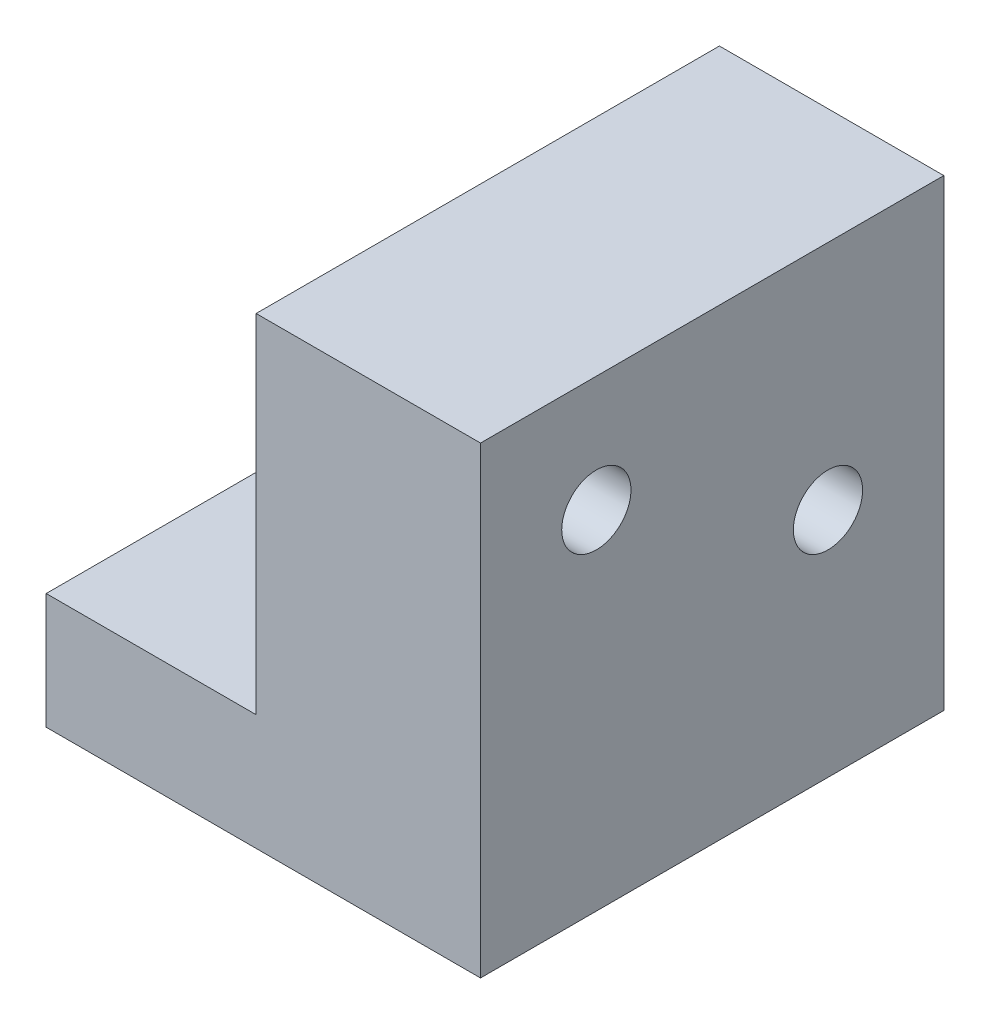
ISO-10303-21;
HEADER;
FILE_DESCRIPTION(('STEP AP214'),'2;1');
FILE_NAME('part.step','',(''),(''),'','','');
FILE_SCHEMA(('AUTOMOTIVE_DESIGN { 1 0 10303 214 1 1 1 1 }'));
ENDSEC;
DATA;
#1=APPLICATION_CONTEXT('core data for automotive mechanical design processes');
#2=APPLICATION_PROTOCOL_DEFINITION('international standard','automotive_design',2000,#1);
#3=PRODUCT_CONTEXT('',#1,'mechanical');
#4=PRODUCT('Part','Part','',(#3));
#5=PRODUCT_RELATED_PRODUCT_CATEGORY('part','',(#4));
#6=PRODUCT_DEFINITION_FORMATION('','',#4);
#7=PRODUCT_DEFINITION_CONTEXT('part definition',#1,'design');
#8=PRODUCT_DEFINITION('design','',#6,#7);
#9=PRODUCT_DEFINITION_SHAPE('','',#8);
#10=(LENGTH_UNIT() NAMED_UNIT(*) SI_UNIT(.MILLI.,.METRE.));
#11=(NAMED_UNIT(*) PLANE_ANGLE_UNIT() SI_UNIT($,.RADIAN.));
#12=(NAMED_UNIT(*) SI_UNIT($,.STERADIAN.) SOLID_ANGLE_UNIT());
#13=UNCERTAINTY_MEASURE_WITH_UNIT(LENGTH_MEASURE(1.E-05),#10,'distance_accuracy_value','');
#14=(GEOMETRIC_REPRESENTATION_CONTEXT(3) GLOBAL_UNCERTAINTY_ASSIGNED_CONTEXT((#13)) GLOBAL_UNIT_ASSIGNED_CONTEXT((#10,
#11,#12)) REPRESENTATION_CONTEXT('',''));
#15=CARTESIAN_POINT('',(0.,0.,0.));
#16=DIRECTION('',(0.,0.,1.));
#17=DIRECTION('',(1.,0.,0.));
#18=AXIS2_PLACEMENT_3D('',#15,#16,#17);
#19=CARTESIAN_POINT('',(-23.8125,12.7,-12.7));
#20=DIRECTION('',(0.,0.,-1.));
#21=DIRECTION('',(0.,1.,0.));
#22=AXIS2_PLACEMENT_3D('',#19,#20,#21);
#23=PLANE('',#22);
#24=DIRECTION('',(0.,1.,0.));
#25=VECTOR('',#24,1.);
#26=CARTESIAN_POINT('',(-12.303125,12.7,-12.7));
#27=LINE('',#26,#25);
#28=CARTESIAN_POINT('',(-12.303125,-6.34999999999999,-12.7));
#29=VERTEX_POINT('',#28);
#30=CARTESIAN_POINT('',(-12.303125,12.7,-12.7));
#31=VERTEX_POINT('',#30);
#32=EDGE_CURVE('E137',#29,#31,#27,.T.);
#33=ORIENTED_EDGE('',*,*,#32,.T.);
#34=DIRECTION('',(1.,0.,0.));
#35=VECTOR('',#34,1.);
#36=CARTESIAN_POINT('',(-23.8125,12.7,-12.7));
#37=LINE('',#36,#35);
#38=CARTESIAN_POINT('',(0.,12.7,-12.7));
#39=VERTEX_POINT('',#38);
#40=EDGE_CURVE('E98',#31,#39,#37,.T.);
#41=ORIENTED_EDGE('',*,*,#40,.T.);
#42=DIRECTION('',(0.,1.,0.));
#43=VECTOR('',#42,1.);
#44=CARTESIAN_POINT('',(0.,12.7,-12.7));
#45=LINE('',#44,#43);
#46=CARTESIAN_POINT('',(0.,-12.7,-12.7));
#47=VERTEX_POINT('',#46);
#48=EDGE_CURVE('E95',#47,#39,#45,.T.);
#49=ORIENTED_EDGE('',*,*,#48,.F.);
#50=DIRECTION('',(1.,0.,0.));
#51=VECTOR('',#50,1.);
#52=CARTESIAN_POINT('',(-23.8125,-12.7,-12.7));
#53=LINE('',#52,#51);
#54=CARTESIAN_POINT('',(-23.8125,-12.7,-12.7));
#55=VERTEX_POINT('',#54);
#56=EDGE_CURVE('E13',#55,#47,#53,.T.);
#57=ORIENTED_EDGE('',*,*,#56,.F.);
#58=DIRECTION('',(0.,1.,0.));
#59=VECTOR('',#58,1.);
#60=CARTESIAN_POINT('',(-23.8125,12.7,-12.7));
#61=LINE('',#60,#59);
#62=CARTESIAN_POINT('',(-23.8125,-6.34999999999999,-12.7));
#63=VERTEX_POINT('',#62);
#64=EDGE_CURVE('E109',#55,#63,#61,.T.);
#65=ORIENTED_EDGE('',*,*,#64,.T.);
#66=DIRECTION('',(1.,0.,0.));
#67=VECTOR('',#66,1.);
#68=CARTESIAN_POINT('',(-23.8125,-6.34999999999999,-12.7));
#69=LINE('',#68,#67);
#70=EDGE_CURVE('E62',#63,#29,#69,.T.);
#71=ORIENTED_EDGE('',*,*,#70,.T.);
#72=EDGE_LOOP('',(#33,#41,#49,#57,#65,#71));
#73=FACE_BOUND('',#72,.T.);
#74=ADVANCED_FACE('F46',(#73),#23,.T.);
#75=CARTESIAN_POINT('',(-23.8125,-12.7,12.7));
#76=DIRECTION('',(0.,-1.,0.));
#77=DIRECTION('',(0.,0.,-1.));
#78=AXIS2_PLACEMENT_3D('',#75,#76,#77);
#79=PLANE('',#78);
#80=DIRECTION('',(0.,0.,-1.));
#81=VECTOR('',#80,1.);
#82=CARTESIAN_POINT('',(0.,-12.7,12.7));
#83=LINE('',#82,#81);
#84=CARTESIAN_POINT('',(0.,-12.7,12.7));
#85=VERTEX_POINT('',#84);
#86=EDGE_CURVE('E91',#85,#47,#83,.T.);
#87=ORIENTED_EDGE('',*,*,#86,.F.);
#88=DIRECTION('',(1.,0.,0.));
#89=VECTOR('',#88,1.);
#90=CARTESIAN_POINT('',(-23.8125,-12.7,12.7));
#91=LINE('',#90,#89);
#92=CARTESIAN_POINT('',(-23.8125,-12.7,12.7));
#93=VERTEX_POINT('',#92);
#94=EDGE_CURVE('E54',#93,#85,#91,.T.);
#95=ORIENTED_EDGE('',*,*,#94,.F.);
#96=DIRECTION('',(0.,0.,-1.));
#97=VECTOR('',#96,1.);
#98=CARTESIAN_POINT('',(-23.8125,-12.7,12.7));
#99=LINE('',#98,#97);
#100=EDGE_CURVE('E93',#93,#55,#99,.T.);
#101=ORIENTED_EDGE('',*,*,#100,.T.);
#102=ORIENTED_EDGE('',*,*,#56,.T.);
#103=EDGE_LOOP('',(#87,#95,#101,#102));
#104=FACE_BOUND('',#103,.T.);
#105=ADVANCED_FACE('F88',(#104),#79,.T.);
#106=CARTESIAN_POINT('',(-23.8125,12.7,12.7));
#107=DIRECTION('',(0.,0.,1.));
#108=DIRECTION('',(0.,-1.,0.));
#109=AXIS2_PLACEMENT_3D('',#106,#107,#108);
#110=PLANE('',#109);
#111=DIRECTION('',(0.,1.,0.));
#112=VECTOR('',#111,1.);
#113=CARTESIAN_POINT('',(-12.303125,12.7,12.7));
#114=LINE('',#113,#112);
#115=CARTESIAN_POINT('',(-12.303125,-6.34999999999999,12.7));
#116=VERTEX_POINT('',#115);
#117=CARTESIAN_POINT('',(-12.303125,12.7,12.7));
#118=VERTEX_POINT('',#117);
#119=EDGE_CURVE('E126',#116,#118,#114,.T.);
#120=ORIENTED_EDGE('',*,*,#119,.F.);
#121=DIRECTION('',(1.,0.,0.));
#122=VECTOR('',#121,1.);
#123=CARTESIAN_POINT('',(-23.8125,-6.34999999999999,12.7));
#124=LINE('',#123,#122);
#125=CARTESIAN_POINT('',(-23.8125,-6.34999999999999,12.7));
#126=VERTEX_POINT('',#125);
#127=EDGE_CURVE('E121',#126,#116,#124,.T.);
#128=ORIENTED_EDGE('',*,*,#127,.F.);
#129=DIRECTION('',(0.,-1.,0.));
#130=VECTOR('',#129,1.);
#131=CARTESIAN_POINT('',(-23.8125,12.7,12.7));
#132=LINE('',#131,#130);
#133=EDGE_CURVE('E111',#126,#93,#132,.T.);
#134=ORIENTED_EDGE('',*,*,#133,.T.);
#135=ORIENTED_EDGE('',*,*,#94,.T.);
#136=DIRECTION('',(0.,-1.,0.));
#137=VECTOR('',#136,1.);
#138=CARTESIAN_POINT('',(0.,12.7,12.7));
#139=LINE('',#138,#137);
#140=CARTESIAN_POINT('',(0.,12.7,12.7));
#141=VERTEX_POINT('',#140);
#142=EDGE_CURVE('E108',#141,#85,#139,.T.);
#143=ORIENTED_EDGE('',*,*,#142,.F.);
#144=DIRECTION('',(1.,0.,0.));
#145=VECTOR('',#144,1.);
#146=CARTESIAN_POINT('',(-23.8125,12.7,12.7));
#147=LINE('',#146,#145);
#148=EDGE_CURVE('E117',#118,#141,#147,.T.);
#149=ORIENTED_EDGE('',*,*,#148,.F.);
#150=EDGE_LOOP('',(#120,#128,#134,#135,#143,#149));
#151=FACE_BOUND('',#150,.T.);
#152=ADVANCED_FACE('F156',(#151),#110,.T.);
#153=CARTESIAN_POINT('',(-23.8125,12.7,12.7));
#154=DIRECTION('',(0.,1.,0.));
#155=DIRECTION('',(0.,0.,1.));
#156=AXIS2_PLACEMENT_3D('',#153,#154,#155);
#157=PLANE('',#156);
#158=DIRECTION('',(0.,0.,1.));
#159=VECTOR('',#158,1.);
#160=CARTESIAN_POINT('',(-12.303125,12.7,-12.7));
#161=LINE('',#160,#159);
#162=EDGE_CURVE('E103',#31,#118,#161,.T.);
#163=ORIENTED_EDGE('',*,*,#162,.T.);
#164=ORIENTED_EDGE('',*,*,#148,.T.);
#165=DIRECTION('',(0.,0.,1.));
#166=VECTOR('',#165,1.);
#167=CARTESIAN_POINT('',(0.,12.7,12.7));
#168=LINE('',#167,#166);
#169=EDGE_CURVE('E102',#39,#141,#168,.T.);
#170=ORIENTED_EDGE('',*,*,#169,.F.);
#171=ORIENTED_EDGE('',*,*,#40,.F.);
#172=EDGE_LOOP('',(#163,#164,#170,#171));
#173=FACE_BOUND('',#172,.T.);
#174=ADVANCED_FACE('F150',(#173),#157,.T.);
#175=CARTESIAN_POINT('',(-23.8125,-12.7,-12.7));
#176=DIRECTION('',(1.,0.,0.));
#177=DIRECTION('',(0.,0.,-1.));
#178=AXIS2_PLACEMENT_3D('',#175,#176,#177);
#179=PLANE('',#178);
#180=ORIENTED_EDGE('',*,*,#133,.F.);
#181=DIRECTION('',(0.,0.,1.));
#182=VECTOR('',#181,1.);
#183=CARTESIAN_POINT('',(-23.8125,-6.34999999999999,-12.7));
#184=LINE('',#183,#182);
#185=EDGE_CURVE('E138',#63,#126,#184,.T.);
#186=ORIENTED_EDGE('',*,*,#185,.F.);
#187=ORIENTED_EDGE('',*,*,#64,.F.);
#188=ORIENTED_EDGE('',*,*,#100,.F.);
#189=EDGE_LOOP('',(#180,#186,#187,#188));
#190=FACE_BOUND('',#189,.T.);
#191=ADVANCED_FACE('F160',(#190),#179,.F.);
#192=CARTESIAN_POINT('',(0.,-12.7,-12.7));
#193=DIRECTION('',(1.,0.,0.));
#194=DIRECTION('',(0.,0.,-1.));
#195=AXIS2_PLACEMENT_3D('',#192,#193,#194);
#196=PLANE('',#195);
#197=CARTESIAN_POINT('',(0.,0.,-6.34999999999999));
#198=DIRECTION('',(-1.,0.,0.));
#199=DIRECTION('',(0.,0.,1.));
#200=AXIS2_PLACEMENT_3D('',#197,#198,#199);
#201=CIRCLE('',#200,1.89864999999999);
#202=CARTESIAN_POINT('',(0.,0.,-4.45135));
#203=VERTEX_POINT('',#202);
#204=EDGE_CURVE('E133',#203,#203,#201,.T.);
#205=ORIENTED_EDGE('',*,*,#204,.T.);
#206=EDGE_LOOP('',(#205));
#207=FACE_BOUND('',#206,.T.);
#208=CARTESIAN_POINT('',(0.,6.35,6.34999999999999));
#209=DIRECTION('',(-1.,0.,0.));
#210=DIRECTION('',(0.,0.,1.));
#211=AXIS2_PLACEMENT_3D('',#208,#209,#210);
#212=CIRCLE('',#211,1.89864999999999);
#213=CARTESIAN_POINT('',(0.,6.35,8.24864999999999));
#214=VERTEX_POINT('',#213);
#215=EDGE_CURVE('E122',#214,#214,#212,.T.);
#216=ORIENTED_EDGE('',*,*,#215,.T.);
#217=EDGE_LOOP('',(#216));
#218=FACE_BOUND('',#217,.T.);
#219=ORIENTED_EDGE('',*,*,#48,.T.);
#220=ORIENTED_EDGE('',*,*,#169,.T.);
#221=ORIENTED_EDGE('',*,*,#142,.T.);
#222=ORIENTED_EDGE('',*,*,#86,.T.);
#223=EDGE_LOOP('',(#219,#220,#221,#222));
#224=FACE_BOUND('',#223,.T.);
#225=ADVANCED_FACE('F106',(#207,#218,#224),#196,.T.);
#226=CARTESIAN_POINT('',(-12.303125,12.7,-12.7));
#227=DIRECTION('',(1.,0.,0.));
#228=DIRECTION('',(0.,1.,0.));
#229=AXIS2_PLACEMENT_3D('',#226,#227,#228);
#230=PLANE('',#229);
#231=CARTESIAN_POINT('',(-12.303125,0.,-6.34999999999999));
#232=DIRECTION('',(1.,0.,0.));
#233=DIRECTION('',(0.,1.,0.));
#234=AXIS2_PLACEMENT_3D('',#231,#232,#233);
#235=CIRCLE('',#234,1.89864999999999);
#236=CARTESIAN_POINT('',(-12.303125,1.89864999999999,-6.34999999999999));
#237=VERTEX_POINT('',#236);
#238=EDGE_CURVE('E49',#237,#237,#235,.T.);
#239=ORIENTED_EDGE('',*,*,#238,.T.);
#240=EDGE_LOOP('',(#239));
#241=FACE_BOUND('',#240,.T.);
#242=CARTESIAN_POINT('',(-12.303125,6.35,6.34999999999999));
#243=DIRECTION('',(1.,0.,0.));
#244=DIRECTION('',(0.,1.,0.));
#245=AXIS2_PLACEMENT_3D('',#242,#243,#244);
#246=CIRCLE('',#245,1.89864999999999);
#247=CARTESIAN_POINT('',(-12.303125,8.24864999999999,6.34999999999999));
#248=VERTEX_POINT('',#247);
#249=EDGE_CURVE('E119',#248,#248,#246,.T.);
#250=ORIENTED_EDGE('',*,*,#249,.T.);
#251=EDGE_LOOP('',(#250));
#252=FACE_BOUND('',#251,.T.);
#253=ORIENTED_EDGE('',*,*,#119,.T.);
#254=ORIENTED_EDGE('',*,*,#162,.F.);
#255=ORIENTED_EDGE('',*,*,#32,.F.);
#256=DIRECTION('',(0.,0.,1.));
#257=VECTOR('',#256,1.);
#258=CARTESIAN_POINT('',(-12.303125,-6.34999999999999,-12.7));
#259=LINE('',#258,#257);
#260=EDGE_CURVE('E144',#29,#116,#259,.T.);
#261=ORIENTED_EDGE('',*,*,#260,.T.);
#262=EDGE_LOOP('',(#253,#254,#255,#261));
#263=FACE_BOUND('',#262,.T.);
#264=ADVANCED_FACE('F170',(#241,#252,#263),#230,.F.);
#265=CARTESIAN_POINT('',(-23.8125,-6.34999999999999,-12.7));
#266=DIRECTION('',(0.,-1.,0.));
#267=DIRECTION('',(0.,0.,-1.));
#268=AXIS2_PLACEMENT_3D('',#265,#266,#267);
#269=PLANE('',#268);
#270=ORIENTED_EDGE('',*,*,#127,.T.);
#271=ORIENTED_EDGE('',*,*,#260,.F.);
#272=ORIENTED_EDGE('',*,*,#70,.F.);
#273=ORIENTED_EDGE('',*,*,#185,.T.);
#274=EDGE_LOOP('',(#270,#271,#272,#273));
#275=FACE_BOUND('',#274,.T.);
#276=ADVANCED_FACE('F171',(#275),#269,.F.);
#277=CARTESIAN_POINT('',(-23.8125,6.35,6.34999999999999));
#278=DIRECTION('',(-1.,0.,0.));
#279=DIRECTION('',(0.,0.,1.));
#280=AXIS2_PLACEMENT_3D('',#277,#278,#279);
#281=CYLINDRICAL_SURFACE('',#280,1.89864999999999);
#282=ORIENTED_EDGE('',*,*,#215,.F.);
#283=EDGE_LOOP('',(#282));
#284=FACE_BOUND('',#283,.T.);
#285=ORIENTED_EDGE('',*,*,#249,.F.);
#286=EDGE_LOOP('',(#285));
#287=FACE_BOUND('',#286,.T.);
#288=ADVANCED_FACE('F173',(#284,#287),#281,.F.);
#289=CARTESIAN_POINT('',(-23.8125,0.,-6.34999999999999));
#290=DIRECTION('',(-1.,0.,0.));
#291=DIRECTION('',(0.,0.,1.));
#292=AXIS2_PLACEMENT_3D('',#289,#290,#291);
#293=CYLINDRICAL_SURFACE('',#292,1.89864999999999);
#294=ORIENTED_EDGE('',*,*,#204,.F.);
#295=EDGE_LOOP('',(#294));
#296=FACE_BOUND('',#295,.T.);
#297=ORIENTED_EDGE('',*,*,#238,.F.);
#298=EDGE_LOOP('',(#297));
#299=FACE_BOUND('',#298,.T.);
#300=ADVANCED_FACE('F179',(#296,#299),#293,.F.);
#301=CLOSED_SHELL('',(#74,#105,#152,#174,#191,#225,#264,#276,#288,#300));
#302=MANIFOLD_SOLID_BREP('B2',#301);
#303=ADVANCED_BREP_SHAPE_REPRESENTATION('',(#18,#302),#14);
#304=SHAPE_DEFINITION_REPRESENTATION(#9,#303);
ENDSEC;
END-ISO-10303-21;
